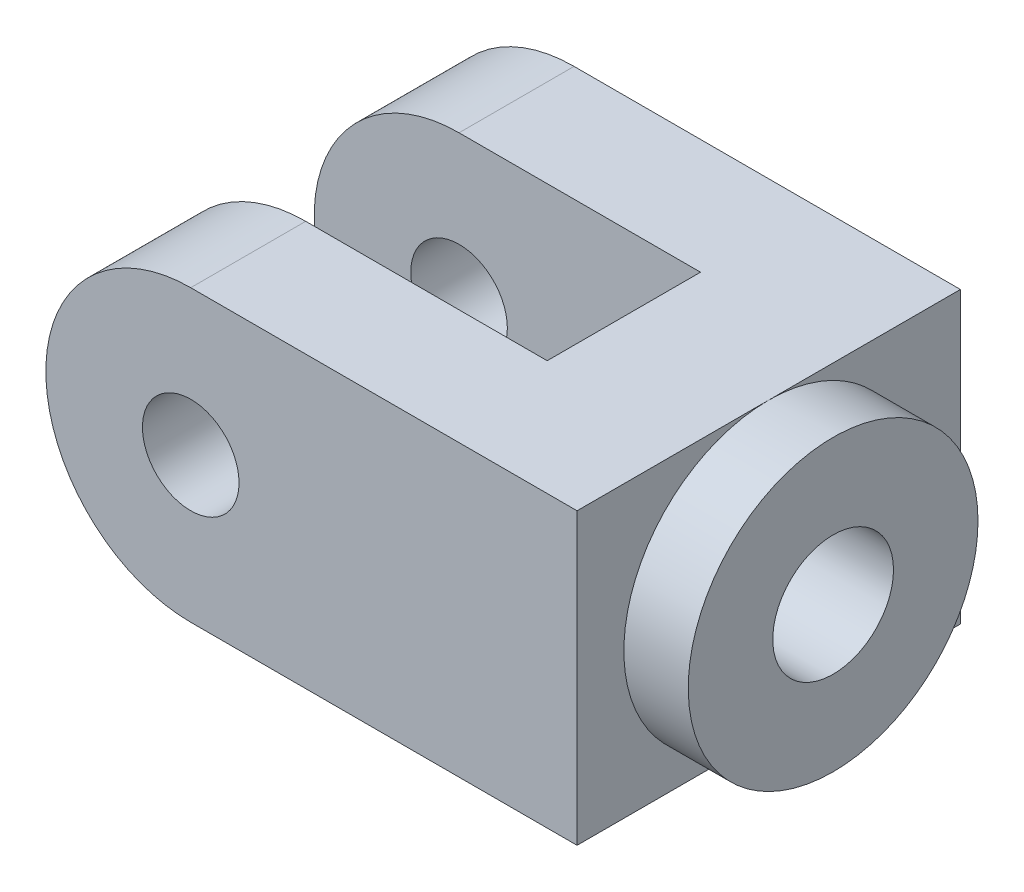
ISO-10303-21;
HEADER;
FILE_DESCRIPTION(('STEP AP214'),'2;1');
FILE_NAME('part.step','',(''),(''),'','','');
FILE_SCHEMA(('AUTOMOTIVE_DESIGN { 1 0 10303 214 1 1 1 1 }'));
ENDSEC;
DATA;
#1=APPLICATION_CONTEXT('core data for automotive mechanical design processes');
#2=APPLICATION_PROTOCOL_DEFINITION('international standard','automotive_design',2000,#1);
#3=PRODUCT_CONTEXT('',#1,'mechanical');
#4=PRODUCT('Part','Part','',(#3));
#5=PRODUCT_RELATED_PRODUCT_CATEGORY('part','',(#4));
#6=PRODUCT_DEFINITION_FORMATION('','',#4);
#7=PRODUCT_DEFINITION_CONTEXT('part definition',#1,'design');
#8=PRODUCT_DEFINITION('design','',#6,#7);
#9=PRODUCT_DEFINITION_SHAPE('','',#8);
#10=(LENGTH_UNIT() NAMED_UNIT(*) SI_UNIT(.MILLI.,.METRE.));
#11=(NAMED_UNIT(*) PLANE_ANGLE_UNIT() SI_UNIT($,.RADIAN.));
#12=(NAMED_UNIT(*) SI_UNIT($,.STERADIAN.) SOLID_ANGLE_UNIT());
#13=UNCERTAINTY_MEASURE_WITH_UNIT(LENGTH_MEASURE(1.E-05),#10,'distance_accuracy_value','');
#14=(GEOMETRIC_REPRESENTATION_CONTEXT(3) GLOBAL_UNCERTAINTY_ASSIGNED_CONTEXT((#13)) GLOBAL_UNIT_ASSIGNED_CONTEXT((#10,
#11,#12)) REPRESENTATION_CONTEXT('',''));
#15=CARTESIAN_POINT('',(0.,0.,0.));
#16=DIRECTION('',(0.,0.,1.));
#17=DIRECTION('',(1.,0.,0.));
#18=AXIS2_PLACEMENT_3D('',#15,#16,#17);
#19=CARTESIAN_POINT('',(66.,-36.,47.625));
#20=DIRECTION('',(-1.,0.,0.));
#21=DIRECTION('',(0.,0.,1.));
#22=AXIS2_PLACEMENT_3D('',#19,#20,#21);
#23=PLANE('',#22);
#24=CARTESIAN_POINT('',(66.,0.,0.));
#25=DIRECTION('',(1.,0.,0.));
#26=DIRECTION('',(0.,0.,-1.));
#27=AXIS2_PLACEMENT_3D('',#24,#25,#26);
#28=CIRCLE('',#27,36.);
#29=CARTESIAN_POINT('',(66.,36.,0.));
#30=VERTEX_POINT('',#29);
#31=CARTESIAN_POINT('',(66.,-36.,0.));
#32=VERTEX_POINT('',#31);
#33=EDGE_CURVE('E48',#30,#32,#28,.T.);
#34=ORIENTED_EDGE('',*,*,#33,.F.);
#35=DIRECTION('',(0.,0.,-1.));
#36=VECTOR('',#35,1.);
#37=CARTESIAN_POINT('',(66.,36.,47.625));
#38=LINE('',#37,#36);
#39=CARTESIAN_POINT('',(66.,36.,47.625));
#40=VERTEX_POINT('',#39);
#41=EDGE_CURVE('E111',#40,#30,#38,.T.);
#42=ORIENTED_EDGE('',*,*,#41,.F.);
#43=DIRECTION('',(0.,1.,0.));
#44=VECTOR('',#43,1.);
#45=CARTESIAN_POINT('',(66.,-36.,47.625));
#46=LINE('',#45,#44);
#47=CARTESIAN_POINT('',(66.,-36.,47.625));
#48=VERTEX_POINT('',#47);
#49=EDGE_CURVE('E199',#48,#40,#46,.T.);
#50=ORIENTED_EDGE('',*,*,#49,.F.);
#51=DIRECTION('',(0.,0.,-1.));
#52=VECTOR('',#51,1.);
#53=CARTESIAN_POINT('',(66.,-36.,47.625));
#54=LINE('',#53,#52);
#55=EDGE_CURVE('E132',#48,#32,#54,.T.);
#56=ORIENTED_EDGE('',*,*,#55,.T.);
#57=EDGE_LOOP('',(#34,#42,#50,#56));
#58=FACE_BOUND('',#57,.T.);
#59=ADVANCED_FACE('F37',(#58),#23,.F.);
#60=CARTESIAN_POINT('',(-30.,0.,389.175429799012));
#61=DIRECTION('',(0.,0.,-1.));
#62=DIRECTION('',(-1.,0.,0.));
#63=AXIS2_PLACEMENT_3D('',#60,#61,#62);
#64=CYLINDRICAL_SURFACE('',#63,36.);
#65=DIRECTION('',(0.,0.,-1.));
#66=VECTOR('',#65,1.);
#67=CARTESIAN_POINT('',(-30.,36.,389.175429799012));
#68=LINE('',#67,#66);
#69=CARTESIAN_POINT('',(-30.,36.,47.625));
#70=VERTEX_POINT('',#69);
#71=CARTESIAN_POINT('',(-30.,36.,19.05));
#72=VERTEX_POINT('',#71);
#73=EDGE_CURVE('E191',#70,#72,#68,.T.);
#74=ORIENTED_EDGE('',*,*,#73,.T.);
#75=CARTESIAN_POINT('',(-30.,0.,19.05));
#76=DIRECTION('',(0.,0.,1.));
#77=DIRECTION('',(1.,0.,0.));
#78=AXIS2_PLACEMENT_3D('',#75,#76,#77);
#79=CIRCLE('',#78,36.);
#80=CARTESIAN_POINT('',(-30.,-36.0000000000001,19.05));
#81=VERTEX_POINT('',#80);
#82=EDGE_CURVE('E46',#72,#81,#79,.T.);
#83=ORIENTED_EDGE('',*,*,#82,.T.);
#84=DIRECTION('',(0.,0.,-1.));
#85=VECTOR('',#84,1.);
#86=CARTESIAN_POINT('',(-30.0000020226622,-36.,389.175429799012));
#87=LINE('',#86,#85);
#88=CARTESIAN_POINT('',(-30.0000020226622,-36.,47.625));
#89=VERTEX_POINT('',#88);
#90=EDGE_CURVE('E180',#89,#81,#87,.T.);
#91=ORIENTED_EDGE('',*,*,#90,.F.);
#92=CARTESIAN_POINT('',(-30.,0.,47.625));
#93=DIRECTION('',(0.,0.,1.));
#94=DIRECTION('',(1.,0.,0.));
#95=AXIS2_PLACEMENT_3D('',#92,#93,#94);
#96=CIRCLE('',#95,36.);
#97=EDGE_CURVE('E186',#89,#70,#96,.F.);
#98=ORIENTED_EDGE('',*,*,#97,.T.);
#99=EDGE_LOOP('',(#74,#83,#91,#98));
#100=FACE_BOUND('',#99,.T.);
#101=ADVANCED_FACE('F155',(#100),#64,.T.);
#102=CARTESIAN_POINT('',(66.,36.,47.625));
#103=DIRECTION('',(0.,-1.,0.));
#104=DIRECTION('',(1.,0.,0.));
#105=AXIS2_PLACEMENT_3D('',#102,#103,#104);
#106=PLANE('',#105);
#107=DIRECTION('',(0.,0.,-1.));
#108=VECTOR('',#107,1.);
#109=CARTESIAN_POINT('',(30.,36.,-19.05));
#110=LINE('',#109,#108);
#111=CARTESIAN_POINT('',(30.,36.,19.05));
#112=VERTEX_POINT('',#111);
#113=CARTESIAN_POINT('',(30.,36.,-19.05));
#114=VERTEX_POINT('',#113);
#115=EDGE_CURVE('E214',#112,#114,#110,.T.);
#116=ORIENTED_EDGE('',*,*,#115,.F.);
#117=DIRECTION('',(1.,0.,0.));
#118=VECTOR('',#117,1.);
#119=CARTESIAN_POINT('',(30.,36.,19.05));
#120=LINE('',#119,#118);
#121=EDGE_CURVE('E228',#72,#112,#120,.T.);
#122=ORIENTED_EDGE('',*,*,#121,.F.);
#123=ORIENTED_EDGE('',*,*,#73,.F.);
#124=DIRECTION('',(-1.,0.,0.));
#125=VECTOR('',#124,1.);
#126=CARTESIAN_POINT('',(66.,36.,47.625));
#127=LINE('',#126,#125);
#128=EDGE_CURVE('E119',#40,#70,#127,.T.);
#129=ORIENTED_EDGE('',*,*,#128,.F.);
#130=ORIENTED_EDGE('',*,*,#41,.T.);
#131=CARTESIAN_POINT('',(66.,36.,-47.625));
#132=VERTEX_POINT('',#131);
#133=EDGE_CURVE('E115',#30,#132,#38,.T.);
#134=ORIENTED_EDGE('',*,*,#133,.T.);
#135=DIRECTION('',(-1.,0.,0.));
#136=VECTOR('',#135,1.);
#137=CARTESIAN_POINT('',(66.,36.,-47.625));
#138=LINE('',#137,#136);
#139=CARTESIAN_POINT('',(-30.,36.,-47.625));
#140=VERTEX_POINT('',#139);
#141=EDGE_CURVE('E200',#132,#140,#138,.T.);
#142=ORIENTED_EDGE('',*,*,#141,.T.);
#143=CARTESIAN_POINT('',(-30.,36.,-19.05));
#144=VERTEX_POINT('',#143);
#145=EDGE_CURVE('E61',#144,#140,#68,.T.);
#146=ORIENTED_EDGE('',*,*,#145,.F.);
#147=DIRECTION('',(-1.,0.,0.));
#148=VECTOR('',#147,1.);
#149=CARTESIAN_POINT('',(30.,36.,-19.05));
#150=LINE('',#149,#148);
#151=EDGE_CURVE('E218',#114,#144,#150,.T.);
#152=ORIENTED_EDGE('',*,*,#151,.F.);
#153=EDGE_LOOP('',(#116,#122,#123,#129,#130,#134,#142,#146,#152));
#154=FACE_BOUND('',#153,.T.);
#155=ADVANCED_FACE('F113',(#154),#106,.F.);
#156=CARTESIAN_POINT('',(0.,0.,47.625));
#157=DIRECTION('',(0.,0.,1.));
#158=DIRECTION('',(1.,0.,0.));
#159=AXIS2_PLACEMENT_3D('',#156,#157,#158);
#160=PLANE('',#159);
#161=CARTESIAN_POINT('',(-30.,0.,47.625));
#162=DIRECTION('',(0.,0.,1.));
#163=DIRECTION('',(1.,0.,0.));
#164=AXIS2_PLACEMENT_3D('',#161,#162,#163);
#165=CIRCLE('',#164,12.);
#166=CARTESIAN_POINT('',(-18.,0.,47.625));
#167=VERTEX_POINT('',#166);
#168=EDGE_CURVE('E398',#167,#167,#165,.T.);
#169=ORIENTED_EDGE('',*,*,#168,.F.);
#170=EDGE_LOOP('',(#169));
#171=FACE_BOUND('',#170,.T.);
#172=ORIENTED_EDGE('',*,*,#97,.F.);
#173=DIRECTION('',(1.,0.,0.));
#174=VECTOR('',#173,1.);
#175=CARTESIAN_POINT('',(66.,-36.,47.625));
#176=LINE('',#175,#174);
#177=EDGE_CURVE('E183',#89,#48,#176,.T.);
#178=ORIENTED_EDGE('',*,*,#177,.T.);
#179=ORIENTED_EDGE('',*,*,#49,.T.);
#180=ORIENTED_EDGE('',*,*,#128,.T.);
#181=EDGE_LOOP('',(#172,#178,#179,#180));
#182=FACE_BOUND('',#181,.T.);
#183=ADVANCED_FACE('F174',(#171,#182),#160,.T.);
#184=CARTESIAN_POINT('',(0.,0.,-47.625));
#185=DIRECTION('',(0.,0.,1.));
#186=DIRECTION('',(1.,0.,0.));
#187=AXIS2_PLACEMENT_3D('',#184,#185,#186);
#188=PLANE('',#187);
#189=CARTESIAN_POINT('',(-30.,0.,-47.625));
#190=DIRECTION('',(0.,0.,1.));
#191=DIRECTION('',(1.,0.,0.));
#192=AXIS2_PLACEMENT_3D('',#189,#190,#191);
#193=CIRCLE('',#192,12.);
#194=CARTESIAN_POINT('',(-18.,0.,-47.625));
#195=VERTEX_POINT('',#194);
#196=EDGE_CURVE('E396',#195,#195,#193,.T.);
#197=ORIENTED_EDGE('',*,*,#196,.T.);
#198=EDGE_LOOP('',(#197));
#199=FACE_BOUND('',#198,.T.);
#200=DIRECTION('',(1.,0.,0.));
#201=VECTOR('',#200,1.);
#202=CARTESIAN_POINT('',(66.,-36.,-47.625));
#203=LINE('',#202,#201);
#204=CARTESIAN_POINT('',(-30.0000020226622,-36.,-47.625));
#205=VERTEX_POINT('',#204);
#206=CARTESIAN_POINT('',(66.,-36.,-47.625));
#207=VERTEX_POINT('',#206);
#208=EDGE_CURVE('E189',#205,#207,#203,.T.);
#209=ORIENTED_EDGE('',*,*,#208,.F.);
#210=CARTESIAN_POINT('',(-30.,0.,-47.625));
#211=DIRECTION('',(0.,0.,1.));
#212=DIRECTION('',(1.,0.,0.));
#213=AXIS2_PLACEMENT_3D('',#210,#211,#212);
#214=CIRCLE('',#213,36.);
#215=EDGE_CURVE('E208',#205,#140,#214,.F.);
#216=ORIENTED_EDGE('',*,*,#215,.T.);
#217=ORIENTED_EDGE('',*,*,#141,.F.);
#218=DIRECTION('',(0.,1.,0.));
#219=VECTOR('',#218,1.);
#220=CARTESIAN_POINT('',(66.,-36.,-47.625));
#221=LINE('',#220,#219);
#222=EDGE_CURVE('E127',#207,#132,#221,.T.);
#223=ORIENTED_EDGE('',*,*,#222,.F.);
#224=EDGE_LOOP('',(#209,#216,#217,#223));
#225=FACE_BOUND('',#224,.T.);
#226=ADVANCED_FACE('F169',(#199,#225),#188,.F.);
#227=CARTESIAN_POINT('',(66.,-36.,47.625));
#228=DIRECTION('',(0.,1.,0.));
#229=DIRECTION('',(-1.,0.,0.));
#230=AXIS2_PLACEMENT_3D('',#227,#228,#229);
#231=PLANE('',#230);
#232=ORIENTED_EDGE('',*,*,#90,.T.);
#233=DIRECTION('',(1.,0.,0.));
#234=VECTOR('',#233,1.);
#235=CARTESIAN_POINT('',(30.,-36.,19.05));
#236=LINE('',#235,#234);
#237=CARTESIAN_POINT('',(30.,-36.,19.05));
#238=VERTEX_POINT('',#237);
#239=EDGE_CURVE('E182',#81,#238,#236,.T.);
#240=ORIENTED_EDGE('',*,*,#239,.T.);
#241=DIRECTION('',(0.,0.,-1.));
#242=VECTOR('',#241,1.);
#243=CARTESIAN_POINT('',(30.,-36.,-19.05));
#244=LINE('',#243,#242);
#245=CARTESIAN_POINT('',(30.,-36.,-19.05));
#246=VERTEX_POINT('',#245);
#247=EDGE_CURVE('E225',#238,#246,#244,.T.);
#248=ORIENTED_EDGE('',*,*,#247,.T.);
#249=DIRECTION('',(-1.,0.,0.));
#250=VECTOR('',#249,1.);
#251=CARTESIAN_POINT('',(30.,-36.,-19.05));
#252=LINE('',#251,#250);
#253=CARTESIAN_POINT('',(-30.,-36.0000000000001,-19.05));
#254=VERTEX_POINT('',#253);
#255=EDGE_CURVE('E227',#246,#254,#252,.T.);
#256=ORIENTED_EDGE('',*,*,#255,.T.);
#257=EDGE_CURVE('E187',#254,#205,#87,.T.);
#258=ORIENTED_EDGE('',*,*,#257,.T.);
#259=ORIENTED_EDGE('',*,*,#208,.T.);
#260=EDGE_CURVE('E123',#32,#207,#54,.T.);
#261=ORIENTED_EDGE('',*,*,#260,.F.);
#262=ORIENTED_EDGE('',*,*,#55,.F.);
#263=ORIENTED_EDGE('',*,*,#177,.F.);
#264=EDGE_LOOP('',(#232,#240,#248,#256,#258,#259,#261,#262,#263));
#265=FACE_BOUND('',#264,.T.);
#266=ADVANCED_FACE('F39',(#265),#231,.F.);
#267=EDGE_CURVE('E11',#32,#30,#28,.T.);
#268=ORIENTED_EDGE('',*,*,#267,.F.);
#269=ORIENTED_EDGE('',*,*,#260,.T.);
#270=ORIENTED_EDGE('',*,*,#222,.T.);
#271=ORIENTED_EDGE('',*,*,#133,.F.);
#272=EDGE_LOOP('',(#268,#269,#270,#271));
#273=FACE_BOUND('',#272,.T.);
#274=ADVANCED_FACE('F125',(#273),#23,.F.);
#275=CARTESIAN_POINT('',(-30.,0.,-19.05));
#276=DIRECTION('',(0.,0.,-1.));
#277=DIRECTION('',(-1.,0.,0.));
#278=AXIS2_PLACEMENT_3D('',#275,#276,#277);
#279=CIRCLE('',#278,36.);
#280=EDGE_CURVE('E210',#254,#144,#279,.T.);
#281=ORIENTED_EDGE('',*,*,#280,.T.);
#282=ORIENTED_EDGE('',*,*,#145,.T.);
#283=ORIENTED_EDGE('',*,*,#215,.F.);
#284=ORIENTED_EDGE('',*,*,#257,.F.);
#285=EDGE_LOOP('',(#281,#282,#283,#284));
#286=FACE_BOUND('',#285,.T.);
#287=ADVANCED_FACE('F161',(#286),#64,.T.);
#288=CARTESIAN_POINT('',(30.,-36.,19.05));
#289=DIRECTION('',(0.,0.,1.));
#290=DIRECTION('',(1.,0.,0.));
#291=AXIS2_PLACEMENT_3D('',#288,#289,#290);
#292=PLANE('',#291);
#293=CARTESIAN_POINT('',(-30.,0.,19.05));
#294=DIRECTION('',(0.,0.,1.));
#295=DIRECTION('',(1.,0.,0.));
#296=AXIS2_PLACEMENT_3D('',#293,#294,#295);
#297=CIRCLE('',#296,12.);
#298=CARTESIAN_POINT('',(-18.,0.,19.05));
#299=VERTEX_POINT('',#298);
#300=EDGE_CURVE('E393',#299,#299,#297,.T.);
#301=ORIENTED_EDGE('',*,*,#300,.T.);
#302=EDGE_LOOP('',(#301));
#303=FACE_BOUND('',#302,.T.);
#304=ORIENTED_EDGE('',*,*,#121,.T.);
#305=DIRECTION('',(0.,1.,0.));
#306=VECTOR('',#305,1.);
#307=CARTESIAN_POINT('',(30.,-36.,19.05));
#308=LINE('',#307,#306);
#309=EDGE_CURVE('E234',#238,#112,#308,.T.);
#310=ORIENTED_EDGE('',*,*,#309,.F.);
#311=ORIENTED_EDGE('',*,*,#239,.F.);
#312=ORIENTED_EDGE('',*,*,#82,.F.);
#313=EDGE_LOOP('',(#304,#310,#311,#312));
#314=FACE_BOUND('',#313,.T.);
#315=ADVANCED_FACE('F168',(#303,#314),#292,.F.);
#316=CARTESIAN_POINT('',(30.,-36.,-19.05));
#317=DIRECTION('',(0.,0.,-1.));
#318=DIRECTION('',(-1.,0.,0.));
#319=AXIS2_PLACEMENT_3D('',#316,#317,#318);
#320=PLANE('',#319);
#321=CARTESIAN_POINT('',(-30.,0.,-19.05));
#322=DIRECTION('',(0.,0.,-1.));
#323=DIRECTION('',(-1.,0.,0.));
#324=AXIS2_PLACEMENT_3D('',#321,#322,#323);
#325=CIRCLE('',#324,12.);
#326=CARTESIAN_POINT('',(-42.,0.,-19.05));
#327=VERTEX_POINT('',#326);
#328=EDGE_CURVE('E41',#327,#327,#325,.T.);
#329=ORIENTED_EDGE('',*,*,#328,.T.);
#330=EDGE_LOOP('',(#329));
#331=FACE_BOUND('',#330,.T.);
#332=ORIENTED_EDGE('',*,*,#280,.F.);
#333=ORIENTED_EDGE('',*,*,#255,.F.);
#334=DIRECTION('',(0.,1.,0.));
#335=VECTOR('',#334,1.);
#336=CARTESIAN_POINT('',(30.,-36.,-19.05));
#337=LINE('',#336,#335);
#338=EDGE_CURVE('E194',#246,#114,#337,.T.);
#339=ORIENTED_EDGE('',*,*,#338,.T.);
#340=ORIENTED_EDGE('',*,*,#151,.T.);
#341=EDGE_LOOP('',(#332,#333,#339,#340));
#342=FACE_BOUND('',#341,.T.);
#343=ADVANCED_FACE('F240',(#331,#342),#320,.F.);
#344=CARTESIAN_POINT('',(30.,-36.,-19.05));
#345=DIRECTION('',(1.,0.,0.));
#346=DIRECTION('',(0.,1.,0.));
#347=AXIS2_PLACEMENT_3D('',#344,#345,#346);
#348=PLANE('',#347);
#349=CARTESIAN_POINT('',(30.,0.,0.));
#350=DIRECTION('',(1.,0.,0.));
#351=DIRECTION('',(0.,1.,0.));
#352=AXIS2_PLACEMENT_3D('',#349,#350,#351);
#353=CIRCLE('',#352,15.);
#354=CARTESIAN_POINT('',(30.,15.,0.));
#355=VERTEX_POINT('',#354);
#356=EDGE_CURVE('E212',#355,#355,#353,.T.);
#357=ORIENTED_EDGE('',*,*,#356,.T.);
#358=EDGE_LOOP('',(#357));
#359=FACE_BOUND('',#358,.T.);
#360=ORIENTED_EDGE('',*,*,#115,.T.);
#361=ORIENTED_EDGE('',*,*,#338,.F.);
#362=ORIENTED_EDGE('',*,*,#247,.F.);
#363=ORIENTED_EDGE('',*,*,#309,.T.);
#364=EDGE_LOOP('',(#360,#361,#362,#363));
#365=FACE_BOUND('',#364,.T.);
#366=ADVANCED_FACE('F242',(#359,#365),#348,.F.);
#367=CARTESIAN_POINT('',(-66.,0.,0.));
#368=DIRECTION('',(1.,0.,0.));
#369=DIRECTION('',(0.,0.,-1.));
#370=AXIS2_PLACEMENT_3D('',#367,#368,#369);
#371=CYLINDRICAL_SURFACE('',#370,15.);
#372=ORIENTED_EDGE('',*,*,#356,.F.);
#373=EDGE_LOOP('',(#372));
#374=FACE_BOUND('',#373,.T.);
#375=CARTESIAN_POINT('',(82.,0.,0.));
#376=DIRECTION('',(1.,0.,0.));
#377=DIRECTION('',(0.,0.,-1.));
#378=AXIS2_PLACEMENT_3D('',#375,#376,#377);
#379=CIRCLE('',#378,15.);
#380=CARTESIAN_POINT('',(82.,0.,-15.));
#381=VERTEX_POINT('',#380);
#382=EDGE_CURVE('E135',#381,#381,#379,.T.);
#383=ORIENTED_EDGE('',*,*,#382,.T.);
#384=EDGE_LOOP('',(#383));
#385=FACE_BOUND('',#384,.T.);
#386=ADVANCED_FACE('F149',(#374,#385),#371,.F.);
#387=CARTESIAN_POINT('',(82.,0.,0.));
#388=DIRECTION('',(1.,0.,0.));
#389=DIRECTION('',(0.,0.,-1.));
#390=AXIS2_PLACEMENT_3D('',#387,#388,#389);
#391=PLANE('',#390);
#392=CARTESIAN_POINT('',(82.,0.,0.));
#393=DIRECTION('',(1.,0.,0.));
#394=DIRECTION('',(0.,0.,-1.));
#395=AXIS2_PLACEMENT_3D('',#392,#393,#394);
#396=CIRCLE('',#395,36.);
#397=CARTESIAN_POINT('',(82.,0.,-36.));
#398=VERTEX_POINT('',#397);
#399=EDGE_CURVE('E134',#398,#398,#396,.T.);
#400=ORIENTED_EDGE('',*,*,#399,.T.);
#401=EDGE_LOOP('',(#400));
#402=FACE_BOUND('',#401,.T.);
#403=ORIENTED_EDGE('',*,*,#382,.F.);
#404=EDGE_LOOP('',(#403));
#405=FACE_BOUND('',#404,.T.);
#406=ADVANCED_FACE('F139',(#402,#405),#391,.T.);
#407=CARTESIAN_POINT('',(82.,0.,0.));
#408=DIRECTION('',(-1.,0.,0.));
#409=DIRECTION('',(0.,0.,1.));
#410=AXIS2_PLACEMENT_3D('',#407,#408,#409);
#411=CYLINDRICAL_SURFACE('',#410,36.);
#412=ORIENTED_EDGE('',*,*,#399,.F.);
#413=EDGE_LOOP('',(#412));
#414=FACE_BOUND('',#413,.T.);
#415=ORIENTED_EDGE('',*,*,#33,.T.);
#416=ORIENTED_EDGE('',*,*,#267,.T.);
#417=EDGE_LOOP('',(#415,#416));
#418=FACE_BOUND('',#417,.T.);
#419=ADVANCED_FACE('F136',(#414,#418),#411,.T.);
#420=CARTESIAN_POINT('',(-30.,0.,-47.625));
#421=DIRECTION('',(0.,0.,1.));
#422=DIRECTION('',(1.,0.,0.));
#423=AXIS2_PLACEMENT_3D('',#420,#421,#422);
#424=CYLINDRICAL_SURFACE('',#423,12.);
#425=ORIENTED_EDGE('',*,*,#196,.F.);
#426=EDGE_LOOP('',(#425));
#427=FACE_BOUND('',#426,.T.);
#428=ORIENTED_EDGE('',*,*,#328,.F.);
#429=EDGE_LOOP('',(#428));
#430=FACE_BOUND('',#429,.T.);
#431=ADVANCED_FACE('F138',(#427,#430),#424,.F.);
#432=ORIENTED_EDGE('',*,*,#168,.T.);
#433=EDGE_LOOP('',(#432));
#434=FACE_BOUND('',#433,.T.);
#435=ORIENTED_EDGE('',*,*,#300,.F.);
#436=EDGE_LOOP('',(#435));
#437=FACE_BOUND('',#436,.T.);
#438=ADVANCED_FACE('F146',(#434,#437),#424,.F.);
#439=CLOSED_SHELL('',(#59,#101,#155,#183,#226,#266,#274,#287,#315,#343,#366,#386,#406,#419,#431,#438));
#440=MANIFOLD_SOLID_BREP('B2',#439);
#441=ADVANCED_BREP_SHAPE_REPRESENTATION('',(#18,#440),#14);
#442=SHAPE_DEFINITION_REPRESENTATION(#9,#441);
ENDSEC;
END-ISO-10303-21;
